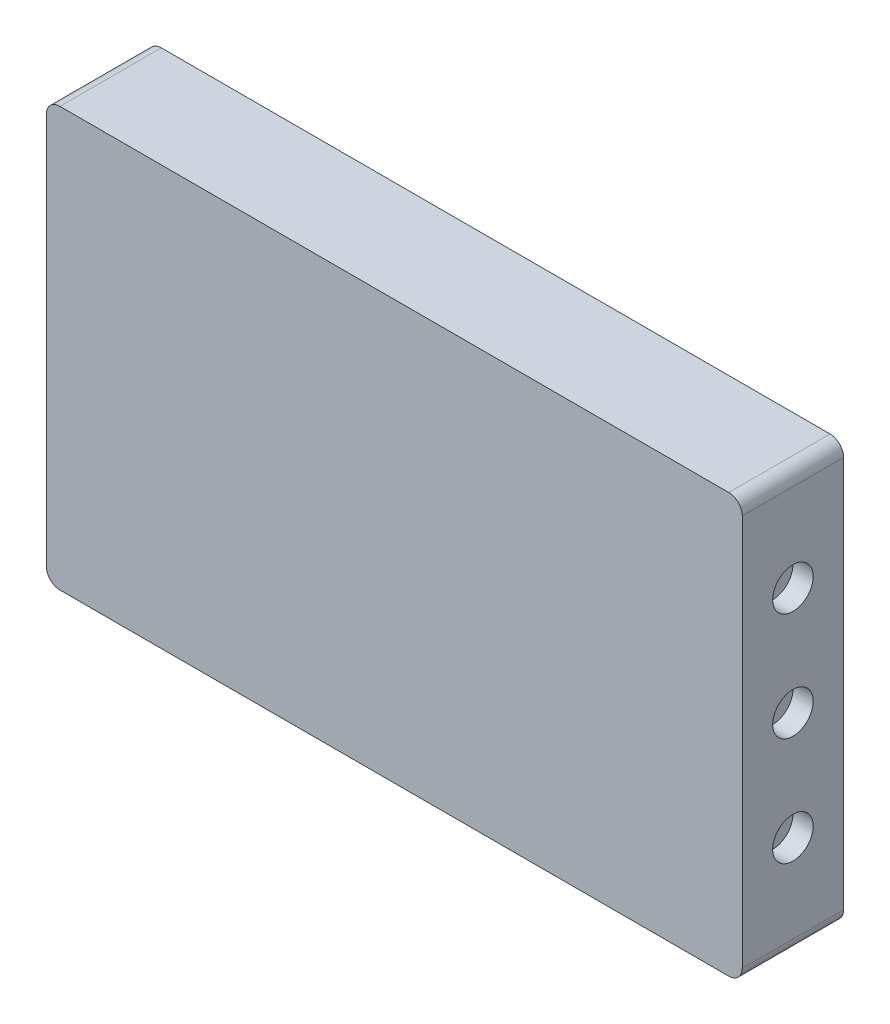
ISO-10303-21;
HEADER;
FILE_DESCRIPTION(('STEP AP214'),'2;1');
FILE_NAME('part.step','',(''),(''),'','','');
FILE_SCHEMA(('AUTOMOTIVE_DESIGN { 1 0 10303 214 1 1 1 1 }'));
ENDSEC;
DATA;
#1=APPLICATION_CONTEXT('core data for automotive mechanical design processes');
#2=APPLICATION_PROTOCOL_DEFINITION('international standard','automotive_design',2000,#1);
#3=PRODUCT_CONTEXT('',#1,'mechanical');
#4=PRODUCT('Part','Part','',(#3));
#5=PRODUCT_RELATED_PRODUCT_CATEGORY('part','',(#4));
#6=PRODUCT_DEFINITION_FORMATION('','',#4);
#7=PRODUCT_DEFINITION_CONTEXT('part definition',#1,'design');
#8=PRODUCT_DEFINITION('design','',#6,#7);
#9=PRODUCT_DEFINITION_SHAPE('','',#8);
#10=(LENGTH_UNIT() NAMED_UNIT(*) SI_UNIT(.MILLI.,.METRE.));
#11=(NAMED_UNIT(*) PLANE_ANGLE_UNIT() SI_UNIT($,.RADIAN.));
#12=(NAMED_UNIT(*) SI_UNIT($,.STERADIAN.) SOLID_ANGLE_UNIT());
#13=UNCERTAINTY_MEASURE_WITH_UNIT(LENGTH_MEASURE(1.E-05),#10,'distance_accuracy_value','');
#14=(GEOMETRIC_REPRESENTATION_CONTEXT(3) GLOBAL_UNCERTAINTY_ASSIGNED_CONTEXT((#13)) GLOBAL_UNIT_ASSIGNED_CONTEXT((#10,
#11,#12)) REPRESENTATION_CONTEXT('',''));
#15=CARTESIAN_POINT('',(0.,0.,0.));
#16=DIRECTION('',(0.,0.,1.));
#17=DIRECTION('',(1.,0.,0.));
#18=AXIS2_PLACEMENT_3D('',#15,#16,#17);
#19=CARTESIAN_POINT('',(51.5,-31.,15.));
#20=DIRECTION('',(-1.,0.,0.));
#21=DIRECTION('',(0.,0.,1.));
#22=AXIS2_PLACEMENT_3D('',#19,#20,#21);
#23=PLANE('',#22);
#24=CARTESIAN_POINT('',(51.5,-16.,7.5));
#25=DIRECTION('',(1.,0.,0.));
#26=DIRECTION('',(0.,0.,-1.));
#27=AXIS2_PLACEMENT_3D('',#24,#25,#26);
#28=CIRCLE('',#27,3.);
#29=CARTESIAN_POINT('',(51.5,-16.,4.5));
#30=VERTEX_POINT('',#29);
#31=EDGE_CURVE('E337',#30,#30,#28,.T.);
#32=ORIENTED_EDGE('',*,*,#31,.F.);
#33=EDGE_LOOP('',(#32));
#34=FACE_BOUND('',#33,.T.);
#35=CARTESIAN_POINT('',(51.5,16.,7.5));
#36=DIRECTION('',(1.,0.,0.));
#37=DIRECTION('',(0.,0.,-1.));
#38=AXIS2_PLACEMENT_3D('',#35,#36,#37);
#39=CIRCLE('',#38,3.);
#40=CARTESIAN_POINT('',(51.5,16.,4.5));
#41=VERTEX_POINT('',#40);
#42=EDGE_CURVE('E336',#41,#41,#39,.T.);
#43=ORIENTED_EDGE('',*,*,#42,.F.);
#44=EDGE_LOOP('',(#43));
#45=FACE_BOUND('',#44,.T.);
#46=CARTESIAN_POINT('',(51.5,0.,7.5));
#47=DIRECTION('',(1.,0.,0.));
#48=DIRECTION('',(0.,0.,-1.));
#49=AXIS2_PLACEMENT_3D('',#46,#47,#48);
#50=CIRCLE('',#49,3.);
#51=CARTESIAN_POINT('',(51.5,0.,4.5));
#52=VERTEX_POINT('',#51);
#53=EDGE_CURVE('E350',#52,#52,#50,.T.);
#54=ORIENTED_EDGE('',*,*,#53,.F.);
#55=EDGE_LOOP('',(#54));
#56=FACE_BOUND('',#55,.T.);
#57=DIRECTION('',(0.,1.,0.));
#58=VECTOR('',#57,1.);
#59=CARTESIAN_POINT('',(51.5,-31.,15.));
#60=LINE('',#59,#58);
#61=CARTESIAN_POINT('',(51.5,-29.,15.));
#62=VERTEX_POINT('',#61);
#63=CARTESIAN_POINT('',(51.5,29.,15.));
#64=VERTEX_POINT('',#63);
#65=EDGE_CURVE('E135',#62,#64,#60,.T.);
#66=ORIENTED_EDGE('',*,*,#65,.F.);
#67=DIRECTION('',(0.,0.,-1.));
#68=VECTOR('',#67,1.);
#69=CARTESIAN_POINT('',(51.5,-29.,15.));
#70=LINE('',#69,#68);
#71=CARTESIAN_POINT('',(51.5,-29.,0.));
#72=VERTEX_POINT('',#71);
#73=EDGE_CURVE('E174',#62,#72,#70,.T.);
#74=ORIENTED_EDGE('',*,*,#73,.T.);
#75=DIRECTION('',(0.,1.,0.));
#76=VECTOR('',#75,1.);
#77=CARTESIAN_POINT('',(51.5,-31.,0.));
#78=LINE('',#77,#76);
#79=CARTESIAN_POINT('',(51.5,29.,0.));
#80=VERTEX_POINT('',#79);
#81=EDGE_CURVE('E189',#72,#80,#78,.T.);
#82=ORIENTED_EDGE('',*,*,#81,.T.);
#83=DIRECTION('',(0.,0.,-1.));
#84=VECTOR('',#83,1.);
#85=CARTESIAN_POINT('',(51.5,29.,15.));
#86=LINE('',#85,#84);
#87=EDGE_CURVE('E171',#80,#64,#86,.F.);
#88=ORIENTED_EDGE('',*,*,#87,.T.);
#89=EDGE_LOOP('',(#66,#74,#82,#88));
#90=FACE_BOUND('',#89,.T.);
#91=ADVANCED_FACE('F39',(#34,#45,#56,#90),#23,.F.);
#92=CARTESIAN_POINT('',(-51.5,31.,15.));
#93=DIRECTION('',(0.,-1.,0.));
#94=DIRECTION('',(0.,0.,-1.));
#95=AXIS2_PLACEMENT_3D('',#92,#93,#94);
#96=PLANE('',#95);
#97=DIRECTION('',(-1.,0.,0.));
#98=VECTOR('',#97,1.);
#99=CARTESIAN_POINT('',(-51.5,31.,15.));
#100=LINE('',#99,#98);
#101=CARTESIAN_POINT('',(49.5,31.,15.));
#102=VERTEX_POINT('',#101);
#103=CARTESIAN_POINT('',(-49.5,31.,15.));
#104=VERTEX_POINT('',#103);
#105=EDGE_CURVE('E140',#102,#104,#100,.T.);
#106=ORIENTED_EDGE('',*,*,#105,.F.);
#107=DIRECTION('',(0.,0.,-1.));
#108=VECTOR('',#107,1.);
#109=CARTESIAN_POINT('',(49.5,31.,15.));
#110=LINE('',#109,#108);
#111=CARTESIAN_POINT('',(49.5,31.,0.));
#112=VERTEX_POINT('',#111);
#113=EDGE_CURVE('E11',#102,#112,#110,.T.);
#114=ORIENTED_EDGE('',*,*,#113,.T.);
#115=DIRECTION('',(-1.,0.,0.));
#116=VECTOR('',#115,1.);
#117=CARTESIAN_POINT('',(-51.5,31.,0.));
#118=LINE('',#117,#116);
#119=CARTESIAN_POINT('',(-49.5,31.,0.));
#120=VERTEX_POINT('',#119);
#121=EDGE_CURVE('E142',#112,#120,#118,.T.);
#122=ORIENTED_EDGE('',*,*,#121,.T.);
#123=DIRECTION('',(0.,0.,-1.));
#124=VECTOR('',#123,1.);
#125=CARTESIAN_POINT('',(-49.5,31.,15.));
#126=LINE('',#125,#124);
#127=EDGE_CURVE('E48',#120,#104,#126,.F.);
#128=ORIENTED_EDGE('',*,*,#127,.T.);
#129=EDGE_LOOP('',(#106,#114,#122,#128));
#130=FACE_BOUND('',#129,.T.);
#131=ADVANCED_FACE('F195',(#130),#96,.F.);
#132=CARTESIAN_POINT('',(-51.5,-31.,15.));
#133=DIRECTION('',(1.,0.,0.));
#134=DIRECTION('',(0.,0.,-1.));
#135=AXIS2_PLACEMENT_3D('',#132,#133,#134);
#136=PLANE('',#135);
#137=DIRECTION('',(0.,-1.,0.));
#138=VECTOR('',#137,1.);
#139=CARTESIAN_POINT('',(-51.5,-31.,0.));
#140=LINE('',#139,#138);
#141=CARTESIAN_POINT('',(-51.5,29.,0.));
#142=VERTEX_POINT('',#141);
#143=CARTESIAN_POINT('',(-51.5,-29.,0.));
#144=VERTEX_POINT('',#143);
#145=EDGE_CURVE('E136',#142,#144,#140,.T.);
#146=ORIENTED_EDGE('',*,*,#145,.T.);
#147=DIRECTION('',(0.,0.,-1.));
#148=VECTOR('',#147,1.);
#149=CARTESIAN_POINT('',(-51.5,-29.,15.));
#150=LINE('',#149,#148);
#151=CARTESIAN_POINT('',(-51.5,-29.,15.));
#152=VERTEX_POINT('',#151);
#153=EDGE_CURVE('E111',#144,#152,#150,.F.);
#154=ORIENTED_EDGE('',*,*,#153,.T.);
#155=DIRECTION('',(0.,-1.,0.));
#156=VECTOR('',#155,1.);
#157=CARTESIAN_POINT('',(-51.5,-31.,15.));
#158=LINE('',#157,#156);
#159=CARTESIAN_POINT('',(-51.5,29.,15.));
#160=VERTEX_POINT('',#159);
#161=EDGE_CURVE('E180',#160,#152,#158,.T.);
#162=ORIENTED_EDGE('',*,*,#161,.F.);
#163=DIRECTION('',(0.,0.,-1.));
#164=VECTOR('',#163,1.);
#165=CARTESIAN_POINT('',(-51.5,29.,15.));
#166=LINE('',#165,#164);
#167=EDGE_CURVE('E117',#160,#142,#166,.T.);
#168=ORIENTED_EDGE('',*,*,#167,.T.);
#169=EDGE_LOOP('',(#146,#154,#162,#168));
#170=FACE_BOUND('',#169,.T.);
#171=ADVANCED_FACE('F202',(#170),#136,.F.);
#172=CARTESIAN_POINT('',(-51.5,-31.,15.));
#173=DIRECTION('',(0.,1.,0.));
#174=DIRECTION('',(0.,0.,1.));
#175=AXIS2_PLACEMENT_3D('',#172,#173,#174);
#176=PLANE('',#175);
#177=DIRECTION('',(1.,0.,0.));
#178=VECTOR('',#177,1.);
#179=CARTESIAN_POINT('',(-51.5,-31.,15.));
#180=LINE('',#179,#178);
#181=CARTESIAN_POINT('',(-49.5,-31.,15.));
#182=VERTEX_POINT('',#181);
#183=CARTESIAN_POINT('',(49.5,-31.,15.));
#184=VERTEX_POINT('',#183);
#185=EDGE_CURVE('E127',#182,#184,#180,.T.);
#186=ORIENTED_EDGE('',*,*,#185,.F.);
#187=DIRECTION('',(0.,0.,-1.));
#188=VECTOR('',#187,1.);
#189=CARTESIAN_POINT('',(-49.5,-31.,15.));
#190=LINE('',#189,#188);
#191=CARTESIAN_POINT('',(-49.5,-31.,0.));
#192=VERTEX_POINT('',#191);
#193=EDGE_CURVE('E110',#182,#192,#190,.T.);
#194=ORIENTED_EDGE('',*,*,#193,.T.);
#195=DIRECTION('',(1.,0.,0.));
#196=VECTOR('',#195,1.);
#197=CARTESIAN_POINT('',(-51.5,-31.,0.));
#198=LINE('',#197,#196);
#199=CARTESIAN_POINT('',(49.5,-31.,0.));
#200=VERTEX_POINT('',#199);
#201=EDGE_CURVE('E124',#192,#200,#198,.T.);
#202=ORIENTED_EDGE('',*,*,#201,.T.);
#203=DIRECTION('',(0.,0.,-1.));
#204=VECTOR('',#203,1.);
#205=CARTESIAN_POINT('',(49.5,-31.,15.));
#206=LINE('',#205,#204);
#207=EDGE_CURVE('E130',#200,#184,#206,.F.);
#208=ORIENTED_EDGE('',*,*,#207,.T.);
#209=EDGE_LOOP('',(#186,#194,#202,#208));
#210=FACE_BOUND('',#209,.T.);
#211=ADVANCED_FACE('F123',(#210),#176,.F.);
#212=CARTESIAN_POINT('',(0.,0.,15.));
#213=DIRECTION('',(0.,0.,-1.));
#214=DIRECTION('',(-1.,0.,0.));
#215=AXIS2_PLACEMENT_3D('',#212,#213,#214);
#216=PLANE('',#215);
#217=ORIENTED_EDGE('',*,*,#161,.T.);
#218=CARTESIAN_POINT('',(-49.5,-29.,15.));
#219=DIRECTION('',(0.,0.,-1.));
#220=DIRECTION('',(-1.,0.,0.));
#221=AXIS2_PLACEMENT_3D('',#218,#219,#220);
#222=CIRCLE('',#221,2.);
#223=EDGE_CURVE('E168',#152,#182,#222,.F.);
#224=ORIENTED_EDGE('',*,*,#223,.T.);
#225=ORIENTED_EDGE('',*,*,#185,.T.);
#226=CARTESIAN_POINT('',(49.5,-29.,15.));
#227=DIRECTION('',(0.,0.,-1.));
#228=DIRECTION('',(-1.,0.,0.));
#229=AXIS2_PLACEMENT_3D('',#226,#227,#228);
#230=CIRCLE('',#229,2.);
#231=EDGE_CURVE('E165',#184,#62,#230,.F.);
#232=ORIENTED_EDGE('',*,*,#231,.T.);
#233=ORIENTED_EDGE('',*,*,#65,.T.);
#234=CARTESIAN_POINT('',(49.5,29.,15.));
#235=DIRECTION('',(0.,0.,-1.));
#236=DIRECTION('',(-1.,0.,0.));
#237=AXIS2_PLACEMENT_3D('',#234,#235,#236);
#238=CIRCLE('',#237,2.);
#239=EDGE_CURVE('E61',#64,#102,#238,.F.);
#240=ORIENTED_EDGE('',*,*,#239,.T.);
#241=ORIENTED_EDGE('',*,*,#105,.T.);
#242=CARTESIAN_POINT('',(-49.5,29.,15.));
#243=DIRECTION('',(0.,0.,-1.));
#244=DIRECTION('',(-1.,0.,0.));
#245=AXIS2_PLACEMENT_3D('',#242,#243,#244);
#246=CIRCLE('',#245,2.);
#247=EDGE_CURVE('E160',#104,#160,#246,.F.);
#248=ORIENTED_EDGE('',*,*,#247,.T.);
#249=EDGE_LOOP('',(#217,#224,#225,#232,#233,#240,#241,#248));
#250=FACE_BOUND('',#249,.T.);
#251=ADVANCED_FACE('F200',(#250),#216,.F.);
#252=CARTESIAN_POINT('',(0.,0.,0.));
#253=DIRECTION('',(0.,0.,-1.));
#254=DIRECTION('',(-1.,0.,0.));
#255=AXIS2_PLACEMENT_3D('',#252,#253,#254);
#256=PLANE('',#255);
#257=ORIENTED_EDGE('',*,*,#201,.F.);
#258=CARTESIAN_POINT('',(-49.5,-29.,0.));
#259=DIRECTION('',(0.,0.,-1.));
#260=DIRECTION('',(-1.,0.,0.));
#261=AXIS2_PLACEMENT_3D('',#258,#259,#260);
#262=CIRCLE('',#261,2.);
#263=EDGE_CURVE('E106',#192,#144,#262,.T.);
#264=ORIENTED_EDGE('',*,*,#263,.T.);
#265=ORIENTED_EDGE('',*,*,#145,.F.);
#266=CARTESIAN_POINT('',(-49.5,29.,0.));
#267=DIRECTION('',(0.,0.,-1.));
#268=DIRECTION('',(-1.,0.,0.));
#269=AXIS2_PLACEMENT_3D('',#266,#267,#268);
#270=CIRCLE('',#269,2.);
#271=EDGE_CURVE('E129',#142,#120,#270,.T.);
#272=ORIENTED_EDGE('',*,*,#271,.T.);
#273=ORIENTED_EDGE('',*,*,#121,.F.);
#274=CARTESIAN_POINT('',(49.5,29.,0.));
#275=DIRECTION('',(0.,0.,-1.));
#276=DIRECTION('',(-1.,0.,0.));
#277=AXIS2_PLACEMENT_3D('',#274,#275,#276);
#278=CIRCLE('',#277,2.);
#279=EDGE_CURVE('E150',#112,#80,#278,.T.);
#280=ORIENTED_EDGE('',*,*,#279,.T.);
#281=ORIENTED_EDGE('',*,*,#81,.F.);
#282=CARTESIAN_POINT('',(49.5,-29.,0.));
#283=DIRECTION('',(0.,0.,-1.));
#284=DIRECTION('',(-1.,0.,0.));
#285=AXIS2_PLACEMENT_3D('',#282,#283,#284);
#286=CIRCLE('',#285,2.);
#287=EDGE_CURVE('E118',#72,#200,#286,.T.);
#288=ORIENTED_EDGE('',*,*,#287,.T.);
#289=EDGE_LOOP('',(#257,#264,#265,#272,#273,#280,#281,#288));
#290=FACE_BOUND('',#289,.T.);
#291=ADVANCED_FACE('F132',(#290),#256,.T.);
#292=CARTESIAN_POINT('',(-49.5,-29.,15.));
#293=DIRECTION('',(0.,0.,-1.));
#294=DIRECTION('',(-1.,0.,0.));
#295=AXIS2_PLACEMENT_3D('',#292,#293,#294);
#296=CYLINDRICAL_SURFACE('',#295,2.);
#297=ORIENTED_EDGE('',*,*,#223,.F.);
#298=ORIENTED_EDGE('',*,*,#153,.F.);
#299=ORIENTED_EDGE('',*,*,#263,.F.);
#300=ORIENTED_EDGE('',*,*,#193,.F.);
#301=EDGE_LOOP('',(#297,#298,#299,#300));
#302=FACE_BOUND('',#301,.T.);
#303=ADVANCED_FACE('F109',(#302),#296,.T.);
#304=CARTESIAN_POINT('',(49.5,-29.,15.));
#305=DIRECTION('',(0.,0.,-1.));
#306=DIRECTION('',(-1.,0.,0.));
#307=AXIS2_PLACEMENT_3D('',#304,#305,#306);
#308=CYLINDRICAL_SURFACE('',#307,2.);
#309=ORIENTED_EDGE('',*,*,#231,.F.);
#310=ORIENTED_EDGE('',*,*,#207,.F.);
#311=ORIENTED_EDGE('',*,*,#287,.F.);
#312=ORIENTED_EDGE('',*,*,#73,.F.);
#313=EDGE_LOOP('',(#309,#310,#311,#312));
#314=FACE_BOUND('',#313,.T.);
#315=ADVANCED_FACE('F221',(#314),#308,.T.);
#316=CARTESIAN_POINT('',(49.5,29.,15.));
#317=DIRECTION('',(0.,0.,-1.));
#318=DIRECTION('',(-1.,0.,0.));
#319=AXIS2_PLACEMENT_3D('',#316,#317,#318);
#320=CYLINDRICAL_SURFACE('',#319,2.);
#321=ORIENTED_EDGE('',*,*,#239,.F.);
#322=ORIENTED_EDGE('',*,*,#87,.F.);
#323=ORIENTED_EDGE('',*,*,#279,.F.);
#324=ORIENTED_EDGE('',*,*,#113,.F.);
#325=EDGE_LOOP('',(#321,#322,#323,#324));
#326=FACE_BOUND('',#325,.T.);
#327=ADVANCED_FACE('F223',(#326),#320,.T.);
#328=CARTESIAN_POINT('',(-49.5,29.,15.));
#329=DIRECTION('',(0.,0.,-1.));
#330=DIRECTION('',(-1.,0.,0.));
#331=AXIS2_PLACEMENT_3D('',#328,#329,#330);
#332=CYLINDRICAL_SURFACE('',#331,2.);
#333=ORIENTED_EDGE('',*,*,#247,.F.);
#334=ORIENTED_EDGE('',*,*,#127,.F.);
#335=ORIENTED_EDGE('',*,*,#271,.F.);
#336=ORIENTED_EDGE('',*,*,#167,.F.);
#337=EDGE_LOOP('',(#333,#334,#335,#336));
#338=FACE_BOUND('',#337,.T.);
#339=ADVANCED_FACE('F41',(#338),#332,.T.);
#340=CARTESIAN_POINT('',(48.5,0.,7.5));
#341=DIRECTION('',(1.,0.,0.));
#342=DIRECTION('',(0.,0.,-1.));
#343=AXIS2_PLACEMENT_3D('',#340,#341,#342);
#344=CYLINDRICAL_SURFACE('',#343,3.);
#345=CARTESIAN_POINT('',(48.5,0.,7.5));
#346=DIRECTION('',(1.,0.,0.));
#347=DIRECTION('',(0.,0.,-1.));
#348=AXIS2_PLACEMENT_3D('',#345,#346,#347);
#349=CIRCLE('',#348,3.);
#350=CARTESIAN_POINT('',(48.5,0.,4.5));
#351=VERTEX_POINT('',#350);
#352=EDGE_CURVE('E192',#351,#351,#349,.T.);
#353=ORIENTED_EDGE('',*,*,#352,.F.);
#354=EDGE_LOOP('',(#353));
#355=FACE_BOUND('',#354,.T.);
#356=ORIENTED_EDGE('',*,*,#53,.T.);
#357=EDGE_LOOP('',(#356));
#358=FACE_BOUND('',#357,.T.);
#359=ADVANCED_FACE('F230',(#355,#358),#344,.F.);
#360=CARTESIAN_POINT('',(48.5,0.,7.5));
#361=DIRECTION('',(1.,0.,0.));
#362=DIRECTION('',(0.,0.,-1.));
#363=AXIS2_PLACEMENT_3D('',#360,#361,#362);
#364=PLANE('',#363);
#365=ORIENTED_EDGE('',*,*,#352,.T.);
#366=EDGE_LOOP('',(#365));
#367=FACE_BOUND('',#366,.T.);
#368=ADVANCED_FACE('F239',(#367),#364,.T.);
#369=CARTESIAN_POINT('',(48.5,16.,7.5));
#370=DIRECTION('',(1.,0.,0.));
#371=DIRECTION('',(0.,0.,-1.));
#372=AXIS2_PLACEMENT_3D('',#369,#370,#371);
#373=CYLINDRICAL_SURFACE('',#372,3.);
#374=CARTESIAN_POINT('',(48.5,16.,7.5));
#375=DIRECTION('',(1.,0.,0.));
#376=DIRECTION('',(0.,0.,-1.));
#377=AXIS2_PLACEMENT_3D('',#374,#375,#376);
#378=CIRCLE('',#377,3.);
#379=CARTESIAN_POINT('',(48.5,16.,4.5));
#380=VERTEX_POINT('',#379);
#381=EDGE_CURVE('E342',#380,#380,#378,.T.);
#382=ORIENTED_EDGE('',*,*,#381,.F.);
#383=EDGE_LOOP('',(#382));
#384=FACE_BOUND('',#383,.T.);
#385=ORIENTED_EDGE('',*,*,#42,.T.);
#386=EDGE_LOOP('',(#385));
#387=FACE_BOUND('',#386,.T.);
#388=ADVANCED_FACE('F245',(#384,#387),#373,.F.);
#389=CARTESIAN_POINT('',(48.5,16.,7.5));
#390=DIRECTION('',(1.,0.,0.));
#391=DIRECTION('',(0.,0.,-1.));
#392=AXIS2_PLACEMENT_3D('',#389,#390,#391);
#393=PLANE('',#392);
#394=ORIENTED_EDGE('',*,*,#381,.T.);
#395=EDGE_LOOP('',(#394));
#396=FACE_BOUND('',#395,.T.);
#397=ADVANCED_FACE('F299',(#396),#393,.T.);
#398=CARTESIAN_POINT('',(48.5,-16.,7.5));
#399=DIRECTION('',(1.,0.,0.));
#400=DIRECTION('',(0.,0.,-1.));
#401=AXIS2_PLACEMENT_3D('',#398,#399,#400);
#402=CYLINDRICAL_SURFACE('',#401,3.);
#403=CARTESIAN_POINT('',(48.5,-16.,7.5));
#404=DIRECTION('',(1.,0.,0.));
#405=DIRECTION('',(0.,0.,-1.));
#406=AXIS2_PLACEMENT_3D('',#403,#404,#405);
#407=CIRCLE('',#406,3.);
#408=CARTESIAN_POINT('',(48.5,-16.,4.5));
#409=VERTEX_POINT('',#408);
#410=EDGE_CURVE('E334',#409,#409,#407,.T.);
#411=ORIENTED_EDGE('',*,*,#410,.F.);
#412=EDGE_LOOP('',(#411));
#413=FACE_BOUND('',#412,.T.);
#414=ORIENTED_EDGE('',*,*,#31,.T.);
#415=EDGE_LOOP('',(#414));
#416=FACE_BOUND('',#415,.T.);
#417=ADVANCED_FACE('F309',(#413,#416),#402,.F.);
#418=CARTESIAN_POINT('',(48.5,-16.,7.5));
#419=DIRECTION('',(1.,0.,0.));
#420=DIRECTION('',(0.,0.,-1.));
#421=AXIS2_PLACEMENT_3D('',#418,#419,#420);
#422=PLANE('',#421);
#423=ORIENTED_EDGE('',*,*,#410,.T.);
#424=EDGE_LOOP('',(#423));
#425=FACE_BOUND('',#424,.T.);
#426=ADVANCED_FACE('F319',(#425),#422,.T.);
#427=CLOSED_SHELL('',(#91,#131,#171,#211,#251,#291,#303,#315,#327,#339,#359,#368,#388,#397,#417,#426));
#428=MANIFOLD_SOLID_BREP('B2',#427);
#429=ADVANCED_BREP_SHAPE_REPRESENTATION('',(#18,#428),#14);
#430=SHAPE_DEFINITION_REPRESENTATION(#9,#429);
ENDSEC;
END-ISO-10303-21;
